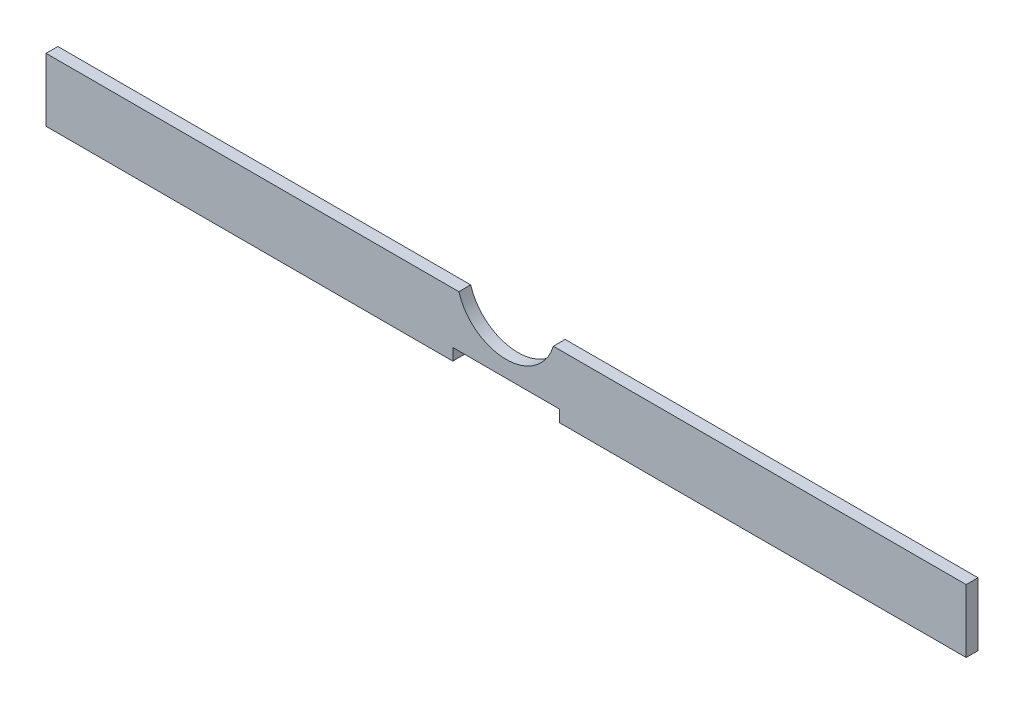
ISO-10303-21;
HEADER;
FILE_DESCRIPTION(('STEP AP214'),'2;1');
FILE_NAME('part.step','',(''),(''),'','','');
FILE_SCHEMA(('AUTOMOTIVE_DESIGN { 1 0 10303 214 1 1 1 1 }'));
ENDSEC;
DATA;
#1=APPLICATION_CONTEXT('core data for automotive mechanical design processes');
#2=APPLICATION_PROTOCOL_DEFINITION('international standard','automotive_design',2000,#1);
#3=PRODUCT_CONTEXT('',#1,'mechanical');
#4=PRODUCT('Part','Part','',(#3));
#5=PRODUCT_RELATED_PRODUCT_CATEGORY('part','',(#4));
#6=PRODUCT_DEFINITION_FORMATION('','',#4);
#7=PRODUCT_DEFINITION_CONTEXT('part definition',#1,'design');
#8=PRODUCT_DEFINITION('design','',#6,#7);
#9=PRODUCT_DEFINITION_SHAPE('','',#8);
#10=(LENGTH_UNIT() NAMED_UNIT(*) SI_UNIT(.MILLI.,.METRE.));
#11=(NAMED_UNIT(*) PLANE_ANGLE_UNIT() SI_UNIT($,.RADIAN.));
#12=(NAMED_UNIT(*) SI_UNIT($,.STERADIAN.) SOLID_ANGLE_UNIT());
#13=UNCERTAINTY_MEASURE_WITH_UNIT(LENGTH_MEASURE(1.E-05),#10,'distance_accuracy_value','');
#14=(GEOMETRIC_REPRESENTATION_CONTEXT(3) GLOBAL_UNCERTAINTY_ASSIGNED_CONTEXT((#13)) GLOBAL_UNIT_ASSIGNED_CONTEXT((#10,
#11,#12)) REPRESENTATION_CONTEXT('',''));
#15=CARTESIAN_POINT('',(0.,0.,0.));
#16=DIRECTION('',(0.,0.,1.));
#17=DIRECTION('',(1.,0.,0.));
#18=AXIS2_PLACEMENT_3D('',#15,#16,#17);
#19=CARTESIAN_POINT('',(11.9613168171402,16.,3.));
#20=DIRECTION('',(0.,-1.,0.));
#21=DIRECTION('',(0.,0.,-1.));
#22=AXIS2_PLACEMENT_3D('',#19,#20,#21);
#23=PLANE('',#22);
#24=DIRECTION('',(-1.,0.,0.));
#25=VECTOR('',#24,1.);
#26=CARTESIAN_POINT('',(11.9613168171402,16.,0.));
#27=LINE('',#26,#25);
#28=CARTESIAN_POINT('',(116.5,16.,0.));
#29=VERTEX_POINT('',#28);
#30=CARTESIAN_POINT('',(11.9613168171402,16.,0.));
#31=VERTEX_POINT('',#30);
#32=EDGE_CURVE('E91',#29,#31,#27,.T.);
#33=ORIENTED_EDGE('',*,*,#32,.T.);
#34=DIRECTION('',(0.,0.,-1.));
#35=VECTOR('',#34,1.);
#36=CARTESIAN_POINT('',(11.9613168171402,16.,3.));
#37=LINE('',#36,#35);
#38=CARTESIAN_POINT('',(11.9613168171402,16.,3.));
#39=VERTEX_POINT('',#38);
#40=EDGE_CURVE('E11',#39,#31,#37,.T.);
#41=ORIENTED_EDGE('',*,*,#40,.F.);
#42=DIRECTION('',(-1.,0.,0.));
#43=VECTOR('',#42,1.);
#44=CARTESIAN_POINT('',(53.5,16.,3.));
#45=LINE('',#44,#43);
#46=CARTESIAN_POINT('',(116.5,16.,3.));
#47=VERTEX_POINT('',#46);
#48=EDGE_CURVE('E97',#47,#39,#45,.T.);
#49=ORIENTED_EDGE('',*,*,#48,.F.);
#50=DIRECTION('',(0.,0.,-1.));
#51=VECTOR('',#50,1.);
#52=CARTESIAN_POINT('',(116.5,16.,3.));
#53=LINE('',#52,#51);
#54=EDGE_CURVE('E137',#47,#29,#53,.T.);
#55=ORIENTED_EDGE('',*,*,#54,.T.);
#56=EDGE_LOOP('',(#33,#41,#49,#55));
#57=FACE_BOUND('',#56,.T.);
#58=ADVANCED_FACE('F33',(#57),#23,.F.);
#59=CARTESIAN_POINT('',(0.,19.63,3.));
#60=DIRECTION('',(0.,0.,-1.));
#61=DIRECTION('',(-1.,0.,0.));
#62=AXIS2_PLACEMENT_3D('',#59,#60,#61);
#63=CYLINDRICAL_SURFACE('',#62,12.5);
#64=CARTESIAN_POINT('',(0.,19.63,0.));
#65=DIRECTION('',(0.,0.,-1.));
#66=DIRECTION('',(1.,0.,0.));
#67=AXIS2_PLACEMENT_3D('',#64,#65,#66);
#68=CIRCLE('',#67,12.5);
#69=CARTESIAN_POINT('',(-11.9613168171402,16.,0.));
#70=VERTEX_POINT('',#69);
#71=EDGE_CURVE('E142',#31,#70,#68,.T.);
#72=ORIENTED_EDGE('',*,*,#71,.T.);
#73=DIRECTION('',(0.,0.,-1.));
#74=VECTOR('',#73,1.);
#75=CARTESIAN_POINT('',(-11.9613168171402,16.,3.));
#76=LINE('',#75,#74);
#77=CARTESIAN_POINT('',(-11.9613168171402,16.,3.));
#78=VERTEX_POINT('',#77);
#79=EDGE_CURVE('E41',#78,#70,#76,.T.);
#80=ORIENTED_EDGE('',*,*,#79,.F.);
#81=CARTESIAN_POINT('',(0.,19.63,3.));
#82=DIRECTION('',(0.,0.,-1.));
#83=DIRECTION('',(1.,0.,0.));
#84=AXIS2_PLACEMENT_3D('',#81,#82,#83);
#85=CIRCLE('',#84,12.5);
#86=EDGE_CURVE('E184',#39,#78,#85,.T.);
#87=ORIENTED_EDGE('',*,*,#86,.F.);
#88=ORIENTED_EDGE('',*,*,#40,.T.);
#89=EDGE_LOOP('',(#72,#80,#87,#88));
#90=FACE_BOUND('',#89,.T.);
#91=ADVANCED_FACE('F183',(#90),#63,.F.);
#92=CARTESIAN_POINT('',(-116.5,16.,3.));
#93=DIRECTION('',(0.,-1.,0.));
#94=DIRECTION('',(0.,0.,-1.));
#95=AXIS2_PLACEMENT_3D('',#92,#93,#94);
#96=PLANE('',#95);
#97=DIRECTION('',(-1.,0.,0.));
#98=VECTOR('',#97,1.);
#99=CARTESIAN_POINT('',(-116.5,16.,0.));
#100=LINE('',#99,#98);
#101=CARTESIAN_POINT('',(-116.5,16.,0.));
#102=VERTEX_POINT('',#101);
#103=EDGE_CURVE('E145',#70,#102,#100,.T.);
#104=ORIENTED_EDGE('',*,*,#103,.T.);
#105=DIRECTION('',(0.,0.,-1.));
#106=VECTOR('',#105,1.);
#107=CARTESIAN_POINT('',(-116.5,16.,3.));
#108=LINE('',#107,#106);
#109=CARTESIAN_POINT('',(-116.5,16.,3.));
#110=VERTEX_POINT('',#109);
#111=EDGE_CURVE('E172',#110,#102,#108,.T.);
#112=ORIENTED_EDGE('',*,*,#111,.F.);
#113=DIRECTION('',(-1.,0.,0.));
#114=VECTOR('',#113,1.);
#115=CARTESIAN_POINT('',(-53.5,16.,3.));
#116=LINE('',#115,#114);
#117=EDGE_CURVE('E180',#78,#110,#116,.T.);
#118=ORIENTED_EDGE('',*,*,#117,.F.);
#119=ORIENTED_EDGE('',*,*,#79,.T.);
#120=EDGE_LOOP('',(#104,#112,#118,#119));
#121=FACE_BOUND('',#120,.T.);
#122=ADVANCED_FACE('F178',(#121),#96,.F.);
#123=CARTESIAN_POINT('',(-116.5,0.,3.));
#124=DIRECTION('',(1.,0.,0.));
#125=DIRECTION('',(0.,0.,-1.));
#126=AXIS2_PLACEMENT_3D('',#123,#124,#125);
#127=PLANE('',#126);
#128=DIRECTION('',(0.,-1.,0.));
#129=VECTOR('',#128,1.);
#130=CARTESIAN_POINT('',(-116.5,0.,0.));
#131=LINE('',#130,#129);
#132=CARTESIAN_POINT('',(-116.5,0.,0.));
#133=VERTEX_POINT('',#132);
#134=EDGE_CURVE('E147',#102,#133,#131,.T.);
#135=ORIENTED_EDGE('',*,*,#134,.T.);
#136=DIRECTION('',(0.,0.,-1.));
#137=VECTOR('',#136,1.);
#138=CARTESIAN_POINT('',(-116.5,0.,3.));
#139=LINE('',#138,#137);
#140=CARTESIAN_POINT('',(-116.5,0.,3.));
#141=VERTEX_POINT('',#140);
#142=EDGE_CURVE('E169',#141,#133,#139,.T.);
#143=ORIENTED_EDGE('',*,*,#142,.F.);
#144=DIRECTION('',(0.,-1.,0.));
#145=VECTOR('',#144,1.);
#146=CARTESIAN_POINT('',(-116.5,0.,3.));
#147=LINE('',#146,#145);
#148=EDGE_CURVE('E200',#110,#141,#147,.T.);
#149=ORIENTED_EDGE('',*,*,#148,.F.);
#150=ORIENTED_EDGE('',*,*,#111,.T.);
#151=EDGE_LOOP('',(#135,#143,#149,#150));
#152=FACE_BOUND('',#151,.T.);
#153=ADVANCED_FACE('F191',(#152),#127,.F.);
#154=CARTESIAN_POINT('',(-116.5,0.,3.));
#155=DIRECTION('',(0.,1.,0.));
#156=DIRECTION('',(0.,0.,1.));
#157=AXIS2_PLACEMENT_3D('',#154,#155,#156);
#158=PLANE('',#157);
#159=DIRECTION('',(1.,0.,0.));
#160=VECTOR('',#159,1.);
#161=CARTESIAN_POINT('',(-116.5,0.,0.));
#162=LINE('',#161,#160);
#163=CARTESIAN_POINT('',(-13.5,0.,0.));
#164=VERTEX_POINT('',#163);
#165=EDGE_CURVE('E149',#133,#164,#162,.T.);
#166=ORIENTED_EDGE('',*,*,#165,.T.);
#167=DIRECTION('',(0.,0.,-1.));
#168=VECTOR('',#167,1.);
#169=CARTESIAN_POINT('',(-13.5,0.,3.));
#170=LINE('',#169,#168);
#171=CARTESIAN_POINT('',(-13.5,0.,3.));
#172=VERTEX_POINT('',#171);
#173=EDGE_CURVE('E166',#172,#164,#170,.T.);
#174=ORIENTED_EDGE('',*,*,#173,.F.);
#175=DIRECTION('',(1.,0.,0.));
#176=VECTOR('',#175,1.);
#177=CARTESIAN_POINT('',(-116.5,0.,3.));
#178=LINE('',#177,#176);
#179=EDGE_CURVE('E197',#141,#172,#178,.T.);
#180=ORIENTED_EDGE('',*,*,#179,.F.);
#181=ORIENTED_EDGE('',*,*,#142,.T.);
#182=EDGE_LOOP('',(#166,#174,#180,#181));
#183=FACE_BOUND('',#182,.T.);
#184=ADVANCED_FACE('F195',(#183),#158,.F.);
#185=CARTESIAN_POINT('',(-13.5,3.,3.));
#186=DIRECTION('',(-1.,0.,0.));
#187=DIRECTION('',(0.,0.,1.));
#188=AXIS2_PLACEMENT_3D('',#185,#186,#187);
#189=PLANE('',#188);
#190=DIRECTION('',(0.,1.,0.));
#191=VECTOR('',#190,1.);
#192=CARTESIAN_POINT('',(-13.5,3.,0.));
#193=LINE('',#192,#191);
#194=CARTESIAN_POINT('',(-13.5,3.,0.));
#195=VERTEX_POINT('',#194);
#196=EDGE_CURVE('E151',#164,#195,#193,.T.);
#197=ORIENTED_EDGE('',*,*,#196,.T.);
#198=DIRECTION('',(0.,0.,-1.));
#199=VECTOR('',#198,1.);
#200=CARTESIAN_POINT('',(-13.5,3.,3.));
#201=LINE('',#200,#199);
#202=CARTESIAN_POINT('',(-13.5,3.,3.));
#203=VERTEX_POINT('',#202);
#204=EDGE_CURVE('E163',#203,#195,#201,.T.);
#205=ORIENTED_EDGE('',*,*,#204,.F.);
#206=DIRECTION('',(0.,1.,0.));
#207=VECTOR('',#206,1.);
#208=CARTESIAN_POINT('',(-13.5,3.,3.));
#209=LINE('',#208,#207);
#210=EDGE_CURVE('E199',#172,#203,#209,.T.);
#211=ORIENTED_EDGE('',*,*,#210,.F.);
#212=ORIENTED_EDGE('',*,*,#173,.T.);
#213=EDGE_LOOP('',(#197,#205,#211,#212));
#214=FACE_BOUND('',#213,.T.);
#215=ADVANCED_FACE('F209',(#214),#189,.F.);
#216=CARTESIAN_POINT('',(13.5,3.,3.));
#217=DIRECTION('',(0.,1.,0.));
#218=DIRECTION('',(0.,0.,1.));
#219=AXIS2_PLACEMENT_3D('',#216,#217,#218);
#220=PLANE('',#219);
#221=DIRECTION('',(1.,0.,0.));
#222=VECTOR('',#221,1.);
#223=CARTESIAN_POINT('',(13.5,3.,0.));
#224=LINE('',#223,#222);
#225=CARTESIAN_POINT('',(13.5,3.,0.));
#226=VERTEX_POINT('',#225);
#227=EDGE_CURVE('E153',#195,#226,#224,.T.);
#228=ORIENTED_EDGE('',*,*,#227,.T.);
#229=DIRECTION('',(0.,0.,-1.));
#230=VECTOR('',#229,1.);
#231=CARTESIAN_POINT('',(13.5,3.,3.));
#232=LINE('',#231,#230);
#233=CARTESIAN_POINT('',(13.5,3.,3.));
#234=VERTEX_POINT('',#233);
#235=EDGE_CURVE('E132',#234,#226,#232,.T.);
#236=ORIENTED_EDGE('',*,*,#235,.F.);
#237=DIRECTION('',(1.,0.,0.));
#238=VECTOR('',#237,1.);
#239=CARTESIAN_POINT('',(13.5,3.,3.));
#240=LINE('',#239,#238);
#241=EDGE_CURVE('E123',#203,#234,#240,.T.);
#242=ORIENTED_EDGE('',*,*,#241,.F.);
#243=ORIENTED_EDGE('',*,*,#204,.T.);
#244=EDGE_LOOP('',(#228,#236,#242,#243));
#245=FACE_BOUND('',#244,.T.);
#246=ADVANCED_FACE('F212',(#245),#220,.F.);
#247=CARTESIAN_POINT('',(13.5,3.,3.));
#248=DIRECTION('',(1.,0.,0.));
#249=DIRECTION('',(0.,0.,-1.));
#250=AXIS2_PLACEMENT_3D('',#247,#248,#249);
#251=PLANE('',#250);
#252=DIRECTION('',(0.,-1.,0.));
#253=VECTOR('',#252,1.);
#254=CARTESIAN_POINT('',(13.5,3.,0.));
#255=LINE('',#254,#253);
#256=CARTESIAN_POINT('',(13.5,0.,0.));
#257=VERTEX_POINT('',#256);
#258=EDGE_CURVE('E131',#226,#257,#255,.T.);
#259=ORIENTED_EDGE('',*,*,#258,.T.);
#260=DIRECTION('',(0.,0.,-1.));
#261=VECTOR('',#260,1.);
#262=CARTESIAN_POINT('',(13.5,0.,3.));
#263=LINE('',#262,#261);
#264=CARTESIAN_POINT('',(13.5,0.,3.));
#265=VERTEX_POINT('',#264);
#266=EDGE_CURVE('E128',#265,#257,#263,.T.);
#267=ORIENTED_EDGE('',*,*,#266,.F.);
#268=DIRECTION('',(0.,-1.,0.));
#269=VECTOR('',#268,1.);
#270=CARTESIAN_POINT('',(13.5,3.,3.));
#271=LINE('',#270,#269);
#272=EDGE_CURVE('E117',#234,#265,#271,.T.);
#273=ORIENTED_EDGE('',*,*,#272,.F.);
#274=ORIENTED_EDGE('',*,*,#235,.T.);
#275=EDGE_LOOP('',(#259,#267,#273,#274));
#276=FACE_BOUND('',#275,.T.);
#277=ADVANCED_FACE('F129',(#276),#251,.F.);
#278=CARTESIAN_POINT('',(13.5,0.,3.));
#279=DIRECTION('',(0.,1.,0.));
#280=DIRECTION('',(0.,0.,1.));
#281=AXIS2_PLACEMENT_3D('',#278,#279,#280);
#282=PLANE('',#281);
#283=DIRECTION('',(1.,0.,0.));
#284=VECTOR('',#283,1.);
#285=CARTESIAN_POINT('',(13.5,0.,0.));
#286=LINE('',#285,#284);
#287=CARTESIAN_POINT('',(116.5,0.,0.));
#288=VERTEX_POINT('',#287);
#289=EDGE_CURVE('E84',#257,#288,#286,.T.);
#290=ORIENTED_EDGE('',*,*,#289,.T.);
#291=DIRECTION('',(0.,0.,-1.));
#292=VECTOR('',#291,1.);
#293=CARTESIAN_POINT('',(116.5,0.,3.));
#294=LINE('',#293,#292);
#295=CARTESIAN_POINT('',(116.5,0.,3.));
#296=VERTEX_POINT('',#295);
#297=EDGE_CURVE('E133',#296,#288,#294,.T.);
#298=ORIENTED_EDGE('',*,*,#297,.F.);
#299=DIRECTION('',(1.,0.,0.));
#300=VECTOR('',#299,1.);
#301=CARTESIAN_POINT('',(13.5,0.,3.));
#302=LINE('',#301,#300);
#303=EDGE_CURVE('E121',#265,#296,#302,.T.);
#304=ORIENTED_EDGE('',*,*,#303,.F.);
#305=ORIENTED_EDGE('',*,*,#266,.T.);
#306=EDGE_LOOP('',(#290,#298,#304,#305));
#307=FACE_BOUND('',#306,.T.);
#308=ADVANCED_FACE('F135',(#307),#282,.F.);
#309=CARTESIAN_POINT('',(116.5,0.,3.));
#310=DIRECTION('',(-1.,0.,0.));
#311=DIRECTION('',(0.,0.,1.));
#312=AXIS2_PLACEMENT_3D('',#309,#310,#311);
#313=PLANE('',#312);
#314=DIRECTION('',(0.,1.,0.));
#315=VECTOR('',#314,1.);
#316=CARTESIAN_POINT('',(116.5,0.,0.));
#317=LINE('',#316,#315);
#318=EDGE_CURVE('E157',#288,#29,#317,.T.);
#319=ORIENTED_EDGE('',*,*,#318,.T.);
#320=ORIENTED_EDGE('',*,*,#54,.F.);
#321=DIRECTION('',(0.,1.,0.));
#322=VECTOR('',#321,1.);
#323=CARTESIAN_POINT('',(116.5,0.,3.));
#324=LINE('',#323,#322);
#325=EDGE_CURVE('E49',#296,#47,#324,.T.);
#326=ORIENTED_EDGE('',*,*,#325,.F.);
#327=ORIENTED_EDGE('',*,*,#297,.T.);
#328=EDGE_LOOP('',(#319,#320,#326,#327));
#329=FACE_BOUND('',#328,.T.);
#330=ADVANCED_FACE('F214',(#329),#313,.F.);
#331=CARTESIAN_POINT('',(0.,19.63,3.));
#332=DIRECTION('',(0.,0.,1.));
#333=DIRECTION('',(1.,0.,0.));
#334=AXIS2_PLACEMENT_3D('',#331,#332,#333);
#335=PLANE('',#334);
#336=ORIENTED_EDGE('',*,*,#48,.T.);
#337=ORIENTED_EDGE('',*,*,#86,.T.);
#338=ORIENTED_EDGE('',*,*,#117,.T.);
#339=ORIENTED_EDGE('',*,*,#148,.T.);
#340=ORIENTED_EDGE('',*,*,#179,.T.);
#341=ORIENTED_EDGE('',*,*,#210,.T.);
#342=ORIENTED_EDGE('',*,*,#241,.T.);
#343=ORIENTED_EDGE('',*,*,#272,.T.);
#344=ORIENTED_EDGE('',*,*,#303,.T.);
#345=ORIENTED_EDGE('',*,*,#325,.T.);
#346=EDGE_LOOP('',(#336,#337,#338,#339,#340,#341,#342,#343,#344,#345));
#347=FACE_BOUND('',#346,.T.);
#348=ADVANCED_FACE('F119',(#347),#335,.T.);
#349=CARTESIAN_POINT('',(0.,19.63,0.));
#350=DIRECTION('',(0.,0.,1.));
#351=DIRECTION('',(1.,0.,0.));
#352=AXIS2_PLACEMENT_3D('',#349,#350,#351);
#353=PLANE('',#352);
#354=ORIENTED_EDGE('',*,*,#32,.F.);
#355=ORIENTED_EDGE('',*,*,#318,.F.);
#356=ORIENTED_EDGE('',*,*,#289,.F.);
#357=ORIENTED_EDGE('',*,*,#258,.F.);
#358=ORIENTED_EDGE('',*,*,#227,.F.);
#359=ORIENTED_EDGE('',*,*,#196,.F.);
#360=ORIENTED_EDGE('',*,*,#165,.F.);
#361=ORIENTED_EDGE('',*,*,#134,.F.);
#362=ORIENTED_EDGE('',*,*,#103,.F.);
#363=ORIENTED_EDGE('',*,*,#71,.F.);
#364=EDGE_LOOP('',(#354,#355,#356,#357,#358,#359,#360,#361,#362,#363));
#365=FACE_BOUND('',#364,.T.);
#366=ADVANCED_FACE('F185',(#365),#353,.F.);
#367=CLOSED_SHELL('',(#58,#91,#122,#153,#184,#215,#246,#277,#308,#330,#348,#366));
#368=MANIFOLD_SOLID_BREP('B2',#367);
#369=ADVANCED_BREP_SHAPE_REPRESENTATION('',(#18,#368),#14);
#370=SHAPE_DEFINITION_REPRESENTATION(#9,#369);
ENDSEC;
END-ISO-10303-21;
